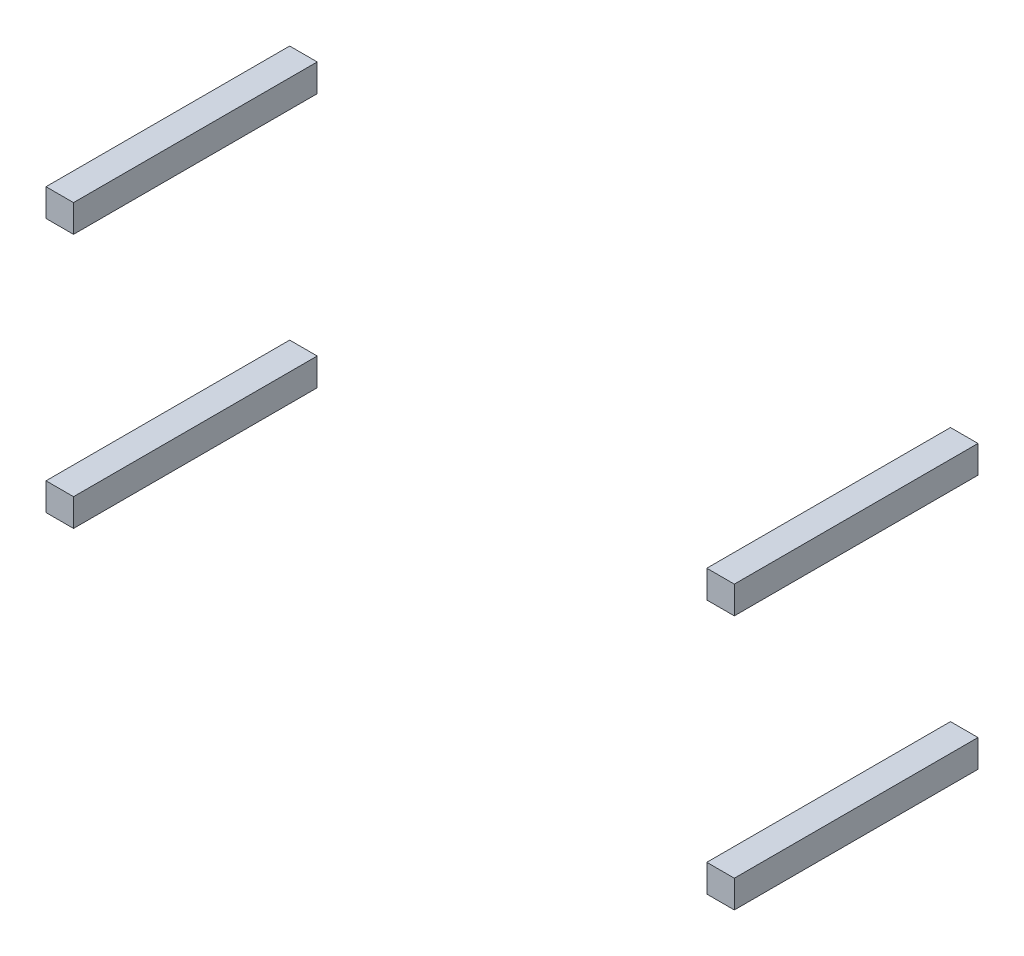
ISO-10303-21;
HEADER;
FILE_DESCRIPTION(('STEP AP214'),'2;1');
FILE_NAME('part.step','',(''),(''),'','','');
FILE_SCHEMA(('AUTOMOTIVE_DESIGN { 1 0 10303 214 1 1 1 1 }'));
ENDSEC;
DATA;
#1=APPLICATION_CONTEXT('core data for automotive mechanical design processes');
#2=APPLICATION_PROTOCOL_DEFINITION('international standard','automotive_design',2000,#1);
#3=PRODUCT_CONTEXT('',#1,'mechanical');
#4=PRODUCT('Part','Part','',(#3));
#5=PRODUCT_RELATED_PRODUCT_CATEGORY('part','',(#4));
#6=PRODUCT_DEFINITION_FORMATION('','',#4);
#7=PRODUCT_DEFINITION_CONTEXT('part definition',#1,'design');
#8=PRODUCT_DEFINITION('design','',#6,#7);
#9=PRODUCT_DEFINITION_SHAPE('','',#8);
#10=(LENGTH_UNIT() NAMED_UNIT(*) SI_UNIT(.MILLI.,.METRE.));
#11=(NAMED_UNIT(*) PLANE_ANGLE_UNIT() SI_UNIT($,.RADIAN.));
#12=(NAMED_UNIT(*) SI_UNIT($,.STERADIAN.) SOLID_ANGLE_UNIT());
#13=UNCERTAINTY_MEASURE_WITH_UNIT(LENGTH_MEASURE(1.E-05),#10,'distance_accuracy_value','');
#14=(GEOMETRIC_REPRESENTATION_CONTEXT(3) GLOBAL_UNCERTAINTY_ASSIGNED_CONTEXT((#13)) GLOBAL_UNIT_ASSIGNED_CONTEXT((#10,
#11,#12)) REPRESENTATION_CONTEXT('',''));
#15=CARTESIAN_POINT('',(0.,0.,0.));
#16=DIRECTION('',(0.,0.,1.));
#17=DIRECTION('',(1.,0.,0.));
#18=AXIS2_PLACEMENT_3D('',#15,#16,#17);
#19=CARTESIAN_POINT('',(-500.,165.,360.));
#20=DIRECTION('',(0.,0.,1.));
#21=DIRECTION('',(1.,0.,0.));
#22=AXIS2_PLACEMENT_3D('',#19,#20,#21);
#23=PLANE('',#22);
#24=DIRECTION('',(0.,1.,0.));
#25=VECTOR('',#24,1.);
#26=CARTESIAN_POINT('',(-500.,165.,360.));
#27=LINE('',#26,#25);
#28=CARTESIAN_POINT('',(-500.,165.,360.));
#29=VERTEX_POINT('',#28);
#30=CARTESIAN_POINT('',(-500.,205.,360.));
#31=VERTEX_POINT('',#30);
#32=EDGE_CURVE('P0_E76',#29,#31,#27,.T.);
#33=ORIENTED_EDGE('',*,*,#32,.F.);
#34=DIRECTION('',(1.,0.,0.));
#35=VECTOR('',#34,1.);
#36=CARTESIAN_POINT('',(-500.,165.,360.));
#37=LINE('',#36,#35);
#38=CARTESIAN_POINT('',(-460.,165.,360.));
#39=VERTEX_POINT('',#38);
#40=EDGE_CURVE('P0_E75',#29,#39,#37,.T.);
#41=ORIENTED_EDGE('',*,*,#40,.T.);
#42=DIRECTION('',(0.,1.,0.));
#43=VECTOR('',#42,1.);
#44=CARTESIAN_POINT('',(-460.,165.,360.));
#45=LINE('',#44,#43);
#46=CARTESIAN_POINT('',(-460.,205.,360.));
#47=VERTEX_POINT('',#46);
#48=EDGE_CURVE('P0_E73',#39,#47,#45,.T.);
#49=ORIENTED_EDGE('',*,*,#48,.T.);
#50=DIRECTION('',(1.,0.,0.));
#51=VECTOR('',#50,1.);
#52=CARTESIAN_POINT('',(-500.,205.,360.));
#53=LINE('',#52,#51);
#54=EDGE_CURVE('P0_E11',#31,#47,#53,.T.);
#55=ORIENTED_EDGE('',*,*,#54,.F.);
#56=EDGE_LOOP('',(#33,#41,#49,#55));
#57=FACE_BOUND('',#56,.T.);
#58=ADVANCED_FACE('P0_F17',(#57),#23,.T.);
#59=CARTESIAN_POINT('',(-500.,165.,6.));
#60=DIRECTION('',(0.,0.,1.));
#61=DIRECTION('',(1.,0.,0.));
#62=AXIS2_PLACEMENT_3D('',#59,#60,#61);
#63=PLANE('',#62);
#64=DIRECTION('',(1.,0.,0.));
#65=VECTOR('',#64,1.);
#66=CARTESIAN_POINT('',(-500.,205.,6.));
#67=LINE('',#66,#65);
#68=CARTESIAN_POINT('',(-500.,205.,6.));
#69=VERTEX_POINT('',#68);
#70=CARTESIAN_POINT('',(-460.,205.,6.));
#71=VERTEX_POINT('',#70);
#72=EDGE_CURVE('P0_E30',#69,#71,#67,.T.);
#73=ORIENTED_EDGE('',*,*,#72,.T.);
#74=DIRECTION('',(0.,1.,0.));
#75=VECTOR('',#74,1.);
#76=CARTESIAN_POINT('',(-460.,165.,6.));
#77=LINE('',#76,#75);
#78=CARTESIAN_POINT('',(-460.,165.,6.));
#79=VERTEX_POINT('',#78);
#80=EDGE_CURVE('P0_E90',#79,#71,#77,.T.);
#81=ORIENTED_EDGE('',*,*,#80,.F.);
#82=DIRECTION('',(1.,0.,0.));
#83=VECTOR('',#82,1.);
#84=CARTESIAN_POINT('',(-500.,165.,6.));
#85=LINE('',#84,#83);
#86=CARTESIAN_POINT('',(-500.,165.,6.));
#87=VERTEX_POINT('',#86);
#88=EDGE_CURVE('P0_E20',#87,#79,#85,.T.);
#89=ORIENTED_EDGE('',*,*,#88,.F.);
#90=DIRECTION('',(0.,1.,0.));
#91=VECTOR('',#90,1.);
#92=CARTESIAN_POINT('',(-500.,165.,6.));
#93=LINE('',#92,#91);
#94=EDGE_CURVE('P0_E100',#87,#69,#93,.T.);
#95=ORIENTED_EDGE('',*,*,#94,.T.);
#96=EDGE_LOOP('',(#73,#81,#89,#95));
#97=FACE_BOUND('',#96,.T.);
#98=ADVANCED_FACE('P0_F143',(#97),#63,.F.);
#99=CARTESIAN_POINT('',(-500.,205.,6.));
#100=DIRECTION('',(0.,1.,0.));
#101=DIRECTION('',(1.,0.,0.));
#102=AXIS2_PLACEMENT_3D('',#99,#100,#101);
#103=PLANE('',#102);
#104=ORIENTED_EDGE('',*,*,#72,.F.);
#105=DIRECTION('',(0.,0.,1.));
#106=VECTOR('',#105,1.);
#107=CARTESIAN_POINT('',(-500.,205.,6.));
#108=LINE('',#107,#106);
#109=EDGE_CURVE('P0_E166',#69,#31,#108,.T.);
#110=ORIENTED_EDGE('',*,*,#109,.T.);
#111=ORIENTED_EDGE('',*,*,#54,.T.);
#112=DIRECTION('',(0.,0.,1.));
#113=VECTOR('',#112,1.);
#114=CARTESIAN_POINT('',(-460.,205.,6.));
#115=LINE('',#114,#113);
#116=EDGE_CURVE('P0_E82',#71,#47,#115,.T.);
#117=ORIENTED_EDGE('',*,*,#116,.F.);
#118=EDGE_LOOP('',(#104,#110,#111,#117));
#119=FACE_BOUND('',#118,.T.);
#120=ADVANCED_FACE('P0_F132',(#119),#103,.T.);
#121=CARTESIAN_POINT('',(-500.,165.,6.));
#122=DIRECTION('',(0.,1.,0.));
#123=DIRECTION('',(1.,0.,0.));
#124=AXIS2_PLACEMENT_3D('',#121,#122,#123);
#125=PLANE('',#124);
#126=DIRECTION('',(0.,0.,1.));
#127=VECTOR('',#126,1.);
#128=CARTESIAN_POINT('',(-460.,165.,6.));
#129=LINE('',#128,#127);
#130=EDGE_CURVE('P0_E83',#79,#39,#129,.T.);
#131=ORIENTED_EDGE('',*,*,#130,.T.);
#132=ORIENTED_EDGE('',*,*,#40,.F.);
#133=DIRECTION('',(0.,0.,1.));
#134=VECTOR('',#133,1.);
#135=CARTESIAN_POINT('',(-500.,165.,6.));
#136=LINE('',#135,#134);
#137=EDGE_CURVE('P0_E89',#87,#29,#136,.T.);
#138=ORIENTED_EDGE('',*,*,#137,.F.);
#139=ORIENTED_EDGE('',*,*,#88,.T.);
#140=EDGE_LOOP('',(#131,#132,#138,#139));
#141=FACE_BOUND('',#140,.T.);
#142=ADVANCED_FACE('P0_F87',(#141),#125,.F.);
#143=CARTESIAN_POINT('',(-460.,165.,6.));
#144=DIRECTION('',(1.,0.,0.));
#145=DIRECTION('',(0.,1.,0.));
#146=AXIS2_PLACEMENT_3D('',#143,#144,#145);
#147=PLANE('',#146);
#148=ORIENTED_EDGE('',*,*,#130,.F.);
#149=ORIENTED_EDGE('',*,*,#80,.T.);
#150=ORIENTED_EDGE('',*,*,#116,.T.);
#151=ORIENTED_EDGE('',*,*,#48,.F.);
#152=EDGE_LOOP('',(#148,#149,#150,#151));
#153=FACE_BOUND('',#152,.T.);
#154=ADVANCED_FACE('P0_F81',(#153),#147,.T.);
#155=CARTESIAN_POINT('',(-500.,165.,6.));
#156=DIRECTION('',(1.,0.,0.));
#157=DIRECTION('',(0.,1.,0.));
#158=AXIS2_PLACEMENT_3D('',#155,#156,#157);
#159=PLANE('',#158);
#160=ORIENTED_EDGE('',*,*,#32,.T.);
#161=ORIENTED_EDGE('',*,*,#109,.F.);
#162=ORIENTED_EDGE('',*,*,#94,.F.);
#163=ORIENTED_EDGE('',*,*,#137,.T.);
#164=EDGE_LOOP('',(#160,#161,#162,#163));
#165=FACE_BOUND('',#164,.T.);
#166=ADVANCED_FACE('P0_F115',(#165),#159,.F.);
#167=CLOSED_SHELL('',(#58,#98,#120,#142,#154,#166));
#168=MANIFOLD_SOLID_BREP('P0_B1',#167);
#169=CARTESIAN_POINT('',(460.,-205.,360.));
#170=DIRECTION('',(0.,0.,1.));
#171=DIRECTION('',(1.,0.,0.));
#172=AXIS2_PLACEMENT_3D('',#169,#170,#171);
#173=PLANE('',#172);
#174=DIRECTION('',(0.,1.,0.));
#175=VECTOR('',#174,1.);
#176=CARTESIAN_POINT('',(460.,-205.,360.));
#177=LINE('',#176,#175);
#178=CARTESIAN_POINT('',(460.,-205.,360.));
#179=VERTEX_POINT('',#178);
#180=CARTESIAN_POINT('',(460.,-165.,360.));
#181=VERTEX_POINT('',#180);
#182=EDGE_CURVE('P1_E100',#179,#181,#177,.T.);
#183=ORIENTED_EDGE('',*,*,#182,.F.);
#184=DIRECTION('',(1.,0.,0.));
#185=VECTOR('',#184,1.);
#186=CARTESIAN_POINT('',(460.,-205.,360.));
#187=LINE('',#186,#185);
#188=CARTESIAN_POINT('',(500.,-205.,360.));
#189=VERTEX_POINT('',#188);
#190=EDGE_CURVE('P1_E78',#179,#189,#187,.T.);
#191=ORIENTED_EDGE('',*,*,#190,.T.);
#192=DIRECTION('',(0.,1.,0.));
#193=VECTOR('',#192,1.);
#194=CARTESIAN_POINT('',(500.,-205.,360.));
#195=LINE('',#194,#193);
#196=CARTESIAN_POINT('',(500.,-165.,360.));
#197=VERTEX_POINT('',#196);
#198=EDGE_CURVE('P1_E101',#189,#197,#195,.T.);
#199=ORIENTED_EDGE('',*,*,#198,.T.);
#200=DIRECTION('',(1.,0.,0.));
#201=VECTOR('',#200,1.);
#202=CARTESIAN_POINT('',(460.,-165.,360.));
#203=LINE('',#202,#201);
#204=EDGE_CURVE('P1_E11',#181,#197,#203,.T.);
#205=ORIENTED_EDGE('',*,*,#204,.F.);
#206=EDGE_LOOP('',(#183,#191,#199,#205));
#207=FACE_BOUND('',#206,.T.);
#208=ADVANCED_FACE('P1_F17',(#207),#173,.T.);
#209=CARTESIAN_POINT('',(460.,-205.,6.));
#210=DIRECTION('',(0.,0.,1.));
#211=DIRECTION('',(1.,0.,0.));
#212=AXIS2_PLACEMENT_3D('',#209,#210,#211);
#213=PLANE('',#212);
#214=DIRECTION('',(1.,0.,0.));
#215=VECTOR('',#214,1.);
#216=CARTESIAN_POINT('',(460.,-165.,6.));
#217=LINE('',#216,#215);
#218=CARTESIAN_POINT('',(460.,-165.,6.));
#219=VERTEX_POINT('',#218);
#220=CARTESIAN_POINT('',(500.,-165.,6.));
#221=VERTEX_POINT('',#220);
#222=EDGE_CURVE('P1_E27',#219,#221,#217,.T.);
#223=ORIENTED_EDGE('',*,*,#222,.T.);
#224=DIRECTION('',(0.,1.,0.));
#225=VECTOR('',#224,1.);
#226=CARTESIAN_POINT('',(500.,-205.,6.));
#227=LINE('',#226,#225);
#228=CARTESIAN_POINT('',(500.,-205.,6.));
#229=VERTEX_POINT('',#228);
#230=EDGE_CURVE('P1_E72',#229,#221,#227,.T.);
#231=ORIENTED_EDGE('',*,*,#230,.F.);
#232=DIRECTION('',(1.,0.,0.));
#233=VECTOR('',#232,1.);
#234=CARTESIAN_POINT('',(460.,-205.,6.));
#235=LINE('',#234,#233);
#236=CARTESIAN_POINT('',(460.,-205.,6.));
#237=VERTEX_POINT('',#236);
#238=EDGE_CURVE('P1_E68',#237,#229,#235,.T.);
#239=ORIENTED_EDGE('',*,*,#238,.F.);
#240=DIRECTION('',(0.,1.,0.));
#241=VECTOR('',#240,1.);
#242=CARTESIAN_POINT('',(460.,-205.,6.));
#243=LINE('',#242,#241);
#244=EDGE_CURVE('P1_E75',#237,#219,#243,.T.);
#245=ORIENTED_EDGE('',*,*,#244,.T.);
#246=EDGE_LOOP('',(#223,#231,#239,#245));
#247=FACE_BOUND('',#246,.T.);
#248=ADVANCED_FACE('P1_F19',(#247),#213,.F.);
#249=CARTESIAN_POINT('',(460.,-165.,6.));
#250=DIRECTION('',(0.,1.,0.));
#251=DIRECTION('',(1.,0.,0.));
#252=AXIS2_PLACEMENT_3D('',#249,#250,#251);
#253=PLANE('',#252);
#254=ORIENTED_EDGE('',*,*,#222,.F.);
#255=DIRECTION('',(0.,0.,1.));
#256=VECTOR('',#255,1.);
#257=CARTESIAN_POINT('',(460.,-165.,6.));
#258=LINE('',#257,#256);
#259=EDGE_CURVE('P1_E93',#219,#181,#258,.T.);
#260=ORIENTED_EDGE('',*,*,#259,.T.);
#261=ORIENTED_EDGE('',*,*,#204,.T.);
#262=DIRECTION('',(0.,0.,1.));
#263=VECTOR('',#262,1.);
#264=CARTESIAN_POINT('',(500.,-165.,6.));
#265=LINE('',#264,#263);
#266=EDGE_CURVE('P1_E105',#221,#197,#265,.T.);
#267=ORIENTED_EDGE('',*,*,#266,.F.);
#268=EDGE_LOOP('',(#254,#260,#261,#267));
#269=FACE_BOUND('',#268,.T.);
#270=ADVANCED_FACE('P1_F139',(#269),#253,.T.);
#271=CARTESIAN_POINT('',(460.,-205.,6.));
#272=DIRECTION('',(0.,1.,0.));
#273=DIRECTION('',(1.,0.,0.));
#274=AXIS2_PLACEMENT_3D('',#271,#272,#273);
#275=PLANE('',#274);
#276=DIRECTION('',(0.,0.,1.));
#277=VECTOR('',#276,1.);
#278=CARTESIAN_POINT('',(500.,-205.,6.));
#279=LINE('',#278,#277);
#280=EDGE_CURVE('P1_E86',#229,#189,#279,.T.);
#281=ORIENTED_EDGE('',*,*,#280,.T.);
#282=ORIENTED_EDGE('',*,*,#190,.F.);
#283=DIRECTION('',(0.,0.,1.));
#284=VECTOR('',#283,1.);
#285=CARTESIAN_POINT('',(460.,-205.,6.));
#286=LINE('',#285,#284);
#287=EDGE_CURVE('P1_E85',#237,#179,#286,.T.);
#288=ORIENTED_EDGE('',*,*,#287,.F.);
#289=ORIENTED_EDGE('',*,*,#238,.T.);
#290=EDGE_LOOP('',(#281,#282,#288,#289));
#291=FACE_BOUND('',#290,.T.);
#292=ADVANCED_FACE('P1_F83',(#291),#275,.F.);
#293=CARTESIAN_POINT('',(500.,-205.,6.));
#294=DIRECTION('',(1.,0.,0.));
#295=DIRECTION('',(0.,1.,0.));
#296=AXIS2_PLACEMENT_3D('',#293,#294,#295);
#297=PLANE('',#296);
#298=ORIENTED_EDGE('',*,*,#280,.F.);
#299=ORIENTED_EDGE('',*,*,#230,.T.);
#300=ORIENTED_EDGE('',*,*,#266,.T.);
#301=ORIENTED_EDGE('',*,*,#198,.F.);
#302=EDGE_LOOP('',(#298,#299,#300,#301));
#303=FACE_BOUND('',#302,.T.);
#304=ADVANCED_FACE('P1_F123',(#303),#297,.T.);
#305=CARTESIAN_POINT('',(460.,-205.,6.));
#306=DIRECTION('',(1.,0.,0.));
#307=DIRECTION('',(0.,1.,0.));
#308=AXIS2_PLACEMENT_3D('',#305,#306,#307);
#309=PLANE('',#308);
#310=ORIENTED_EDGE('',*,*,#182,.T.);
#311=ORIENTED_EDGE('',*,*,#259,.F.);
#312=ORIENTED_EDGE('',*,*,#244,.F.);
#313=ORIENTED_EDGE('',*,*,#287,.T.);
#314=EDGE_LOOP('',(#310,#311,#312,#313));
#315=FACE_BOUND('',#314,.T.);
#316=ADVANCED_FACE('P1_F89',(#315),#309,.F.);
#317=CLOSED_SHELL('',(#208,#248,#270,#292,#304,#316));
#318=MANIFOLD_SOLID_BREP('P1_B1',#317);
#319=CARTESIAN_POINT('',(-500.,-205.,360.));
#320=DIRECTION('',(0.,0.,1.));
#321=DIRECTION('',(1.,0.,0.));
#322=AXIS2_PLACEMENT_3D('',#319,#320,#321);
#323=PLANE('',#322);
#324=DIRECTION('',(0.,1.,0.));
#325=VECTOR('',#324,1.);
#326=CARTESIAN_POINT('',(-500.,-205.,360.));
#327=LINE('',#326,#325);
#328=CARTESIAN_POINT('',(-500.,-205.,360.));
#329=VERTEX_POINT('',#328);
#330=CARTESIAN_POINT('',(-500.,-165.,360.));
#331=VERTEX_POINT('',#330);
#332=EDGE_CURVE('P2_E86',#329,#331,#327,.T.);
#333=ORIENTED_EDGE('',*,*,#332,.F.);
#334=DIRECTION('',(1.,0.,0.));
#335=VECTOR('',#334,1.);
#336=CARTESIAN_POINT('',(-500.,-205.,360.));
#337=LINE('',#336,#335);
#338=CARTESIAN_POINT('',(-460.,-205.,360.));
#339=VERTEX_POINT('',#338);
#340=EDGE_CURVE('P2_E69',#329,#339,#337,.T.);
#341=ORIENTED_EDGE('',*,*,#340,.T.);
#342=DIRECTION('',(0.,1.,0.));
#343=VECTOR('',#342,1.);
#344=CARTESIAN_POINT('',(-460.,-205.,360.));
#345=LINE('',#344,#343);
#346=CARTESIAN_POINT('',(-460.,-165.,360.));
#347=VERTEX_POINT('',#346);
#348=EDGE_CURVE('P2_E85',#339,#347,#345,.T.);
#349=ORIENTED_EDGE('',*,*,#348,.T.);
#350=DIRECTION('',(1.,0.,0.));
#351=VECTOR('',#350,1.);
#352=CARTESIAN_POINT('',(-500.,-165.,360.));
#353=LINE('',#352,#351);
#354=EDGE_CURVE('P2_E11',#331,#347,#353,.T.);
#355=ORIENTED_EDGE('',*,*,#354,.F.);
#356=EDGE_LOOP('',(#333,#341,#349,#355));
#357=FACE_BOUND('',#356,.T.);
#358=ADVANCED_FACE('P2_F17',(#357),#323,.T.);
#359=CARTESIAN_POINT('',(-500.,-205.,6.));
#360=DIRECTION('',(0.,0.,1.));
#361=DIRECTION('',(1.,0.,0.));
#362=AXIS2_PLACEMENT_3D('',#359,#360,#361);
#363=PLANE('',#362);
#364=DIRECTION('',(1.,0.,0.));
#365=VECTOR('',#364,1.);
#366=CARTESIAN_POINT('',(-500.,-165.,6.));
#367=LINE('',#366,#365);
#368=CARTESIAN_POINT('',(-500.,-165.,6.));
#369=VERTEX_POINT('',#368);
#370=CARTESIAN_POINT('',(-460.,-165.,6.));
#371=VERTEX_POINT('',#370);
#372=EDGE_CURVE('P2_E25',#369,#371,#367,.T.);
#373=ORIENTED_EDGE('',*,*,#372,.T.);
#374=DIRECTION('',(0.,1.,0.));
#375=VECTOR('',#374,1.);
#376=CARTESIAN_POINT('',(-460.,-205.,6.));
#377=LINE('',#376,#375);
#378=CARTESIAN_POINT('',(-460.,-205.,6.));
#379=VERTEX_POINT('',#378);
#380=EDGE_CURVE('P2_E109',#379,#371,#377,.T.);
#381=ORIENTED_EDGE('',*,*,#380,.F.);
#382=DIRECTION('',(1.,0.,0.));
#383=VECTOR('',#382,1.);
#384=CARTESIAN_POINT('',(-500.,-205.,6.));
#385=LINE('',#384,#383);
#386=CARTESIAN_POINT('',(-500.,-205.,6.));
#387=VERTEX_POINT('',#386);
#388=EDGE_CURVE('P2_E81',#387,#379,#385,.T.);
#389=ORIENTED_EDGE('',*,*,#388,.F.);
#390=DIRECTION('',(0.,1.,0.));
#391=VECTOR('',#390,1.);
#392=CARTESIAN_POINT('',(-500.,-205.,6.));
#393=LINE('',#392,#391);
#394=EDGE_CURVE('P2_E90',#387,#369,#393,.T.);
#395=ORIENTED_EDGE('',*,*,#394,.T.);
#396=EDGE_LOOP('',(#373,#381,#389,#395));
#397=FACE_BOUND('',#396,.T.);
#398=ADVANCED_FACE('P2_F141',(#397),#363,.F.);
#399=CARTESIAN_POINT('',(-500.,-165.,6.));
#400=DIRECTION('',(0.,1.,0.));
#401=DIRECTION('',(1.,0.,0.));
#402=AXIS2_PLACEMENT_3D('',#399,#400,#401);
#403=PLANE('',#402);
#404=ORIENTED_EDGE('',*,*,#372,.F.);
#405=DIRECTION('',(0.,0.,1.));
#406=VECTOR('',#405,1.);
#407=CARTESIAN_POINT('',(-500.,-165.,6.));
#408=LINE('',#407,#406);
#409=EDGE_CURVE('P2_E91',#369,#331,#408,.T.);
#410=ORIENTED_EDGE('',*,*,#409,.T.);
#411=ORIENTED_EDGE('',*,*,#354,.T.);
#412=DIRECTION('',(0.,0.,1.));
#413=VECTOR('',#412,1.);
#414=CARTESIAN_POINT('',(-460.,-165.,6.));
#415=LINE('',#414,#413);
#416=EDGE_CURVE('P2_E105',#371,#347,#415,.T.);
#417=ORIENTED_EDGE('',*,*,#416,.F.);
#418=EDGE_LOOP('',(#404,#410,#411,#417));
#419=FACE_BOUND('',#418,.T.);
#420=ADVANCED_FACE('P2_F138',(#419),#403,.T.);
#421=CARTESIAN_POINT('',(-500.,-205.,6.));
#422=DIRECTION('',(0.,1.,0.));
#423=DIRECTION('',(1.,0.,0.));
#424=AXIS2_PLACEMENT_3D('',#421,#422,#423);
#425=PLANE('',#424);
#426=DIRECTION('',(0.,0.,1.));
#427=VECTOR('',#426,1.);
#428=CARTESIAN_POINT('',(-460.,-205.,6.));
#429=LINE('',#428,#427);
#430=EDGE_CURVE('P2_E76',#379,#339,#429,.T.);
#431=ORIENTED_EDGE('',*,*,#430,.T.);
#432=ORIENTED_EDGE('',*,*,#340,.F.);
#433=DIRECTION('',(0.,0.,1.));
#434=VECTOR('',#433,1.);
#435=CARTESIAN_POINT('',(-500.,-205.,6.));
#436=LINE('',#435,#434);
#437=EDGE_CURVE('P2_E73',#387,#329,#436,.T.);
#438=ORIENTED_EDGE('',*,*,#437,.F.);
#439=ORIENTED_EDGE('',*,*,#388,.T.);
#440=EDGE_LOOP('',(#431,#432,#438,#439));
#441=FACE_BOUND('',#440,.T.);
#442=ADVANCED_FACE('P2_F71',(#441),#425,.F.);
#443=CARTESIAN_POINT('',(-460.,-205.,6.));
#444=DIRECTION('',(1.,0.,0.));
#445=DIRECTION('',(0.,1.,0.));
#446=AXIS2_PLACEMENT_3D('',#443,#444,#445);
#447=PLANE('',#446);
#448=ORIENTED_EDGE('',*,*,#430,.F.);
#449=ORIENTED_EDGE('',*,*,#380,.T.);
#450=ORIENTED_EDGE('',*,*,#416,.T.);
#451=ORIENTED_EDGE('',*,*,#348,.F.);
#452=EDGE_LOOP('',(#448,#449,#450,#451));
#453=FACE_BOUND('',#452,.T.);
#454=ADVANCED_FACE('P2_F122',(#453),#447,.T.);
#455=CARTESIAN_POINT('',(-500.,-205.,6.));
#456=DIRECTION('',(1.,0.,0.));
#457=DIRECTION('',(0.,1.,0.));
#458=AXIS2_PLACEMENT_3D('',#455,#456,#457);
#459=PLANE('',#458);
#460=ORIENTED_EDGE('',*,*,#332,.T.);
#461=ORIENTED_EDGE('',*,*,#409,.F.);
#462=ORIENTED_EDGE('',*,*,#394,.F.);
#463=ORIENTED_EDGE('',*,*,#437,.T.);
#464=EDGE_LOOP('',(#460,#461,#462,#463));
#465=FACE_BOUND('',#464,.T.);
#466=ADVANCED_FACE('P2_F88',(#465),#459,.F.);
#467=CLOSED_SHELL('',(#358,#398,#420,#442,#454,#466));
#468=MANIFOLD_SOLID_BREP('P2_B1',#467);
#469=CARTESIAN_POINT('',(460.,165.,360.));
#470=DIRECTION('',(0.,0.,1.));
#471=DIRECTION('',(1.,0.,0.));
#472=AXIS2_PLACEMENT_3D('',#469,#470,#471);
#473=PLANE('',#472);
#474=DIRECTION('',(0.,1.,0.));
#475=VECTOR('',#474,1.);
#476=CARTESIAN_POINT('',(460.,165.,360.));
#477=LINE('',#476,#475);
#478=CARTESIAN_POINT('',(460.,165.,360.));
#479=VERTEX_POINT('',#478);
#480=CARTESIAN_POINT('',(460.,205.,360.));
#481=VERTEX_POINT('',#480);
#482=EDGE_CURVE('P3_E87',#479,#481,#477,.T.);
#483=ORIENTED_EDGE('',*,*,#482,.F.);
#484=DIRECTION('',(1.,0.,0.));
#485=VECTOR('',#484,1.);
#486=CARTESIAN_POINT('',(460.,165.,360.));
#487=LINE('',#486,#485);
#488=CARTESIAN_POINT('',(500.,165.,360.));
#489=VERTEX_POINT('',#488);
#490=EDGE_CURVE('P3_E67',#479,#489,#487,.T.);
#491=ORIENTED_EDGE('',*,*,#490,.T.);
#492=DIRECTION('',(0.,1.,0.));
#493=VECTOR('',#492,1.);
#494=CARTESIAN_POINT('',(500.,165.,360.));
#495=LINE('',#494,#493);
#496=CARTESIAN_POINT('',(500.,205.,360.));
#497=VERTEX_POINT('',#496);
#498=EDGE_CURVE('P3_E81',#489,#497,#495,.T.);
#499=ORIENTED_EDGE('',*,*,#498,.T.);
#500=DIRECTION('',(1.,0.,0.));
#501=VECTOR('',#500,1.);
#502=CARTESIAN_POINT('',(460.,205.,360.));
#503=LINE('',#502,#501);
#504=EDGE_CURVE('P3_E10',#481,#497,#503,.T.);
#505=ORIENTED_EDGE('',*,*,#504,.F.);
#506=EDGE_LOOP('',(#483,#491,#499,#505));
#507=FACE_BOUND('',#506,.T.);
#508=ADVANCED_FACE('P3_F16',(#507),#473,.T.);
#509=CARTESIAN_POINT('',(460.,165.,6.));
#510=DIRECTION('',(0.,0.,1.));
#511=DIRECTION('',(1.,0.,0.));
#512=AXIS2_PLACEMENT_3D('',#509,#510,#511);
#513=PLANE('',#512);
#514=DIRECTION('',(1.,0.,0.));
#515=VECTOR('',#514,1.);
#516=CARTESIAN_POINT('',(460.,205.,6.));
#517=LINE('',#516,#515);
#518=CARTESIAN_POINT('',(460.,205.,6.));
#519=VERTEX_POINT('',#518);
#520=CARTESIAN_POINT('',(500.,205.,6.));
#521=VERTEX_POINT('',#520);
#522=EDGE_CURVE('P3_E24',#519,#521,#517,.T.);
#523=ORIENTED_EDGE('',*,*,#522,.T.);
#524=DIRECTION('',(0.,1.,0.));
#525=VECTOR('',#524,1.);
#526=CARTESIAN_POINT('',(500.,165.,6.));
#527=LINE('',#526,#525);
#528=CARTESIAN_POINT('',(500.,165.,6.));
#529=VERTEX_POINT('',#528);
#530=EDGE_CURVE('P3_E104',#529,#521,#527,.T.);
#531=ORIENTED_EDGE('',*,*,#530,.F.);
#532=DIRECTION('',(1.,0.,0.));
#533=VECTOR('',#532,1.);
#534=CARTESIAN_POINT('',(460.,165.,6.));
#535=LINE('',#534,#533);
#536=CARTESIAN_POINT('',(460.,165.,6.));
#537=VERTEX_POINT('',#536);
#538=EDGE_CURVE('P3_E79',#537,#529,#535,.T.);
#539=ORIENTED_EDGE('',*,*,#538,.F.);
#540=DIRECTION('',(0.,1.,0.));
#541=VECTOR('',#540,1.);
#542=CARTESIAN_POINT('',(460.,165.,6.));
#543=LINE('',#542,#541);
#544=EDGE_CURVE('P3_E86',#537,#519,#543,.T.);
#545=ORIENTED_EDGE('',*,*,#544,.T.);
#546=EDGE_LOOP('',(#523,#531,#539,#545));
#547=FACE_BOUND('',#546,.T.);
#548=ADVANCED_FACE('P3_F149',(#547),#513,.F.);
#549=CARTESIAN_POINT('',(460.,205.,6.));
#550=DIRECTION('',(0.,1.,0.));
#551=DIRECTION('',(1.,0.,0.));
#552=AXIS2_PLACEMENT_3D('',#549,#550,#551);
#553=PLANE('',#552);
#554=ORIENTED_EDGE('',*,*,#522,.F.);
#555=DIRECTION('',(0.,0.,1.));
#556=VECTOR('',#555,1.);
#557=CARTESIAN_POINT('',(460.,205.,6.));
#558=LINE('',#557,#556);
#559=EDGE_CURVE('P3_E95',#519,#481,#558,.T.);
#560=ORIENTED_EDGE('',*,*,#559,.T.);
#561=ORIENTED_EDGE('',*,*,#504,.T.);
#562=DIRECTION('',(0.,0.,1.));
#563=VECTOR('',#562,1.);
#564=CARTESIAN_POINT('',(500.,205.,6.));
#565=LINE('',#564,#563);
#566=EDGE_CURVE('P3_E105',#521,#497,#565,.T.);
#567=ORIENTED_EDGE('',*,*,#566,.F.);
#568=EDGE_LOOP('',(#554,#560,#561,#567));
#569=FACE_BOUND('',#568,.T.);
#570=ADVANCED_FACE('P3_F143',(#569),#553,.T.);
#571=CARTESIAN_POINT('',(460.,165.,6.));
#572=DIRECTION('',(0.,1.,0.));
#573=DIRECTION('',(1.,0.,0.));
#574=AXIS2_PLACEMENT_3D('',#571,#572,#573);
#575=PLANE('',#574);
#576=DIRECTION('',(0.,0.,1.));
#577=VECTOR('',#576,1.);
#578=CARTESIAN_POINT('',(500.,165.,6.));
#579=LINE('',#578,#577);
#580=EDGE_CURVE('P3_E74',#529,#489,#579,.T.);
#581=ORIENTED_EDGE('',*,*,#580,.T.);
#582=ORIENTED_EDGE('',*,*,#490,.F.);
#583=DIRECTION('',(0.,0.,1.));
#584=VECTOR('',#583,1.);
#585=CARTESIAN_POINT('',(460.,165.,6.));
#586=LINE('',#585,#584);
#587=EDGE_CURVE('P3_E71',#537,#479,#586,.T.);
#588=ORIENTED_EDGE('',*,*,#587,.F.);
#589=ORIENTED_EDGE('',*,*,#538,.T.);
#590=EDGE_LOOP('',(#581,#582,#588,#589));
#591=FACE_BOUND('',#590,.T.);
#592=ADVANCED_FACE('P3_F75',(#591),#575,.F.);
#593=CARTESIAN_POINT('',(500.,165.,6.));
#594=DIRECTION('',(1.,0.,0.));
#595=DIRECTION('',(0.,1.,0.));
#596=AXIS2_PLACEMENT_3D('',#593,#594,#595);
#597=PLANE('',#596);
#598=ORIENTED_EDGE('',*,*,#580,.F.);
#599=ORIENTED_EDGE('',*,*,#530,.T.);
#600=ORIENTED_EDGE('',*,*,#566,.T.);
#601=ORIENTED_EDGE('',*,*,#498,.F.);
#602=EDGE_LOOP('',(#598,#599,#600,#601));
#603=FACE_BOUND('',#602,.T.);
#604=ADVANCED_FACE('P3_F120',(#603),#597,.T.);
#605=CARTESIAN_POINT('',(460.,165.,6.));
#606=DIRECTION('',(1.,0.,0.));
#607=DIRECTION('',(0.,1.,0.));
#608=AXIS2_PLACEMENT_3D('',#605,#606,#607);
#609=PLANE('',#608);
#610=ORIENTED_EDGE('',*,*,#482,.T.);
#611=ORIENTED_EDGE('',*,*,#559,.F.);
#612=ORIENTED_EDGE('',*,*,#544,.F.);
#613=ORIENTED_EDGE('',*,*,#587,.T.);
#614=EDGE_LOOP('',(#610,#611,#612,#613));
#615=FACE_BOUND('',#614,.T.);
#616=ADVANCED_FACE('P3_F84',(#615),#609,.F.);
#617=CLOSED_SHELL('',(#508,#548,#570,#592,#604,#616));
#618=MANIFOLD_SOLID_BREP('P3_B1',#617);
#619=ADVANCED_BREP_SHAPE_REPRESENTATION('',(#18,#168,#318,#468,#618),#14);
#620=SHAPE_DEFINITION_REPRESENTATION(#9,#619);
ENDSEC;
END-ISO-10303-21;
